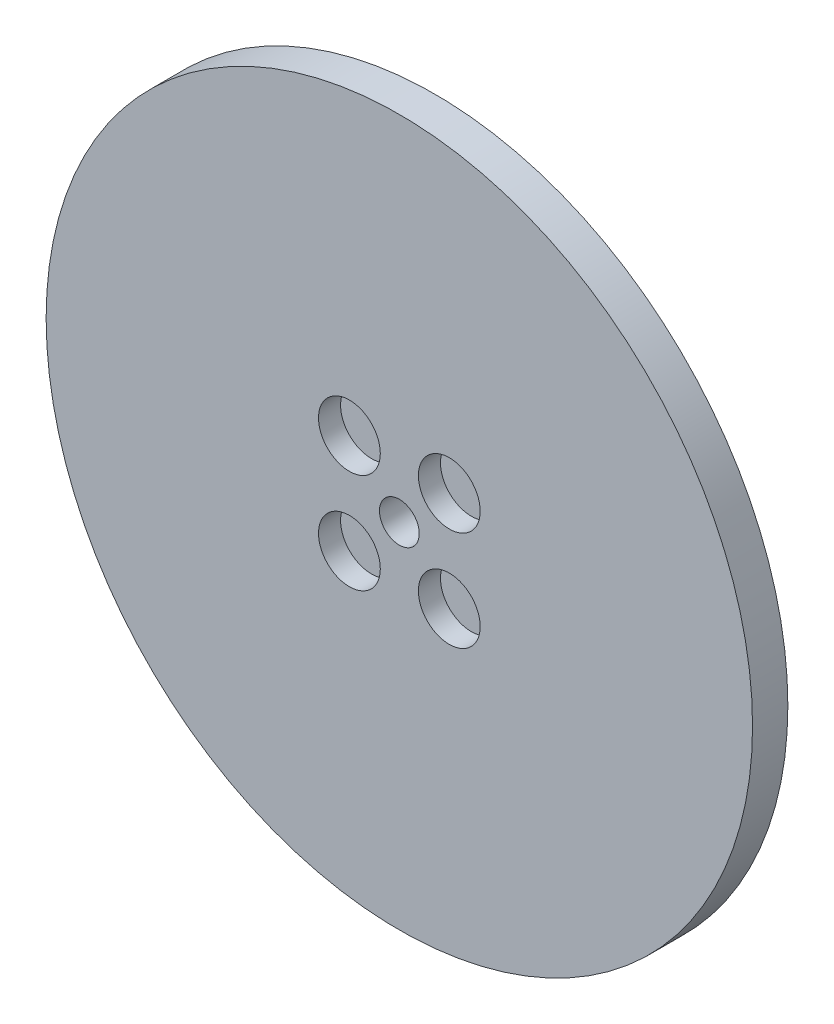
ISO-10303-21;
HEADER;
FILE_DESCRIPTION(('STEP AP214'),'2;1');
FILE_NAME('part.step','',(''),(''),'','','');
FILE_SCHEMA(('AUTOMOTIVE_DESIGN { 1 0 10303 214 1 1 1 1 }'));
ENDSEC;
DATA;
#1=APPLICATION_CONTEXT('core data for automotive mechanical design processes');
#2=APPLICATION_PROTOCOL_DEFINITION('international standard','automotive_design',2000,#1);
#3=PRODUCT_CONTEXT('',#1,'mechanical');
#4=PRODUCT('Part','Part','',(#3));
#5=PRODUCT_RELATED_PRODUCT_CATEGORY('part','',(#4));
#6=PRODUCT_DEFINITION_FORMATION('','',#4);
#7=PRODUCT_DEFINITION_CONTEXT('part definition',#1,'design');
#8=PRODUCT_DEFINITION('design','',#6,#7);
#9=PRODUCT_DEFINITION_SHAPE('','',#8);
#10=(LENGTH_UNIT() NAMED_UNIT(*) SI_UNIT(.MILLI.,.METRE.));
#11=(NAMED_UNIT(*) PLANE_ANGLE_UNIT() SI_UNIT($,.RADIAN.));
#12=(NAMED_UNIT(*) SI_UNIT($,.STERADIAN.) SOLID_ANGLE_UNIT());
#13=UNCERTAINTY_MEASURE_WITH_UNIT(LENGTH_MEASURE(1.E-05),#10,'distance_accuracy_value','');
#14=(GEOMETRIC_REPRESENTATION_CONTEXT(3) GLOBAL_UNCERTAINTY_ASSIGNED_CONTEXT((#13)) GLOBAL_UNIT_ASSIGNED_CONTEXT((#10,
#11,#12)) REPRESENTATION_CONTEXT('',''));
#15=CARTESIAN_POINT('',(0.,0.,0.));
#16=DIRECTION('',(0.,0.,1.));
#17=DIRECTION('',(1.,0.,0.));
#18=AXIS2_PLACEMENT_3D('',#15,#16,#17);
#19=CARTESIAN_POINT('',(5.65599974191923,-5.65770862800566,8.));
#20=DIRECTION('',(0.,0.,-1.));
#21=DIRECTION('',(-1.,0.,0.));
#22=AXIS2_PLACEMENT_3D('',#19,#20,#21);
#23=CYLINDRICAL_SURFACE('',#22,1.5);
#24=CARTESIAN_POINT('',(5.65599974191923,-5.65770862800566,4.));
#25=DIRECTION('',(0.,0.,1.));
#26=DIRECTION('',(1.,0.,0.));
#27=AXIS2_PLACEMENT_3D('',#24,#25,#26);
#28=CIRCLE('',#27,1.5);
#29=CARTESIAN_POINT('',(7.15599974191923,-5.65770862800566,4.));
#30=VERTEX_POINT('',#29);
#31=EDGE_CURVE('E188',#30,#30,#28,.T.);
#32=ORIENTED_EDGE('',*,*,#31,.F.);
#33=EDGE_LOOP('',(#32));
#34=FACE_BOUND('',#33,.T.);
#35=CARTESIAN_POINT('',(5.65599974191923,-5.65770862800566,5.3));
#36=DIRECTION('',(0.,0.,1.));
#37=DIRECTION('',(1.,0.,0.));
#38=AXIS2_PLACEMENT_3D('',#35,#36,#37);
#39=CIRCLE('',#38,1.5);
#40=CARTESIAN_POINT('',(7.15599974191923,-5.65770862800566,5.3));
#41=VERTEX_POINT('',#40);
#42=EDGE_CURVE('E43',#41,#41,#39,.T.);
#43=ORIENTED_EDGE('',*,*,#42,.T.);
#44=EDGE_LOOP('',(#43));
#45=FACE_BOUND('',#44,.T.);
#46=ADVANCED_FACE('F39',(#34,#45),#23,.F.);
#47=CARTESIAN_POINT('',(-5.65599974191923,-5.65770862800566,8.));
#48=DIRECTION('',(0.,0.,-1.));
#49=DIRECTION('',(-1.,0.,0.));
#50=AXIS2_PLACEMENT_3D('',#47,#48,#49);
#51=CYLINDRICAL_SURFACE('',#50,1.5);
#52=CARTESIAN_POINT('',(-5.65599974191923,-5.65770862800566,4.));
#53=DIRECTION('',(0.,0.,1.));
#54=DIRECTION('',(1.,0.,0.));
#55=AXIS2_PLACEMENT_3D('',#52,#53,#54);
#56=CIRCLE('',#55,1.5);
#57=CARTESIAN_POINT('',(-4.15599974191923,-5.65770862800566,4.));
#58=VERTEX_POINT('',#57);
#59=EDGE_CURVE('E185',#58,#58,#56,.T.);
#60=ORIENTED_EDGE('',*,*,#59,.F.);
#61=EDGE_LOOP('',(#60));
#62=FACE_BOUND('',#61,.T.);
#63=CARTESIAN_POINT('',(-5.65599974191923,-5.65770862800566,5.3));
#64=DIRECTION('',(0.,0.,1.));
#65=DIRECTION('',(1.,0.,0.));
#66=AXIS2_PLACEMENT_3D('',#63,#64,#65);
#67=CIRCLE('',#66,1.5);
#68=CARTESIAN_POINT('',(-4.15599974191923,-5.65770862800566,5.3));
#69=VERTEX_POINT('',#68);
#70=EDGE_CURVE('E63',#69,#69,#67,.T.);
#71=ORIENTED_EDGE('',*,*,#70,.T.);
#72=EDGE_LOOP('',(#71));
#73=FACE_BOUND('',#72,.T.);
#74=ADVANCED_FACE('F82',(#62,#73),#51,.F.);
#75=CARTESIAN_POINT('',(5.65599974191923,5.65770862800566,8.));
#76=DIRECTION('',(0.,0.,-1.));
#77=DIRECTION('',(-1.,0.,0.));
#78=AXIS2_PLACEMENT_3D('',#75,#76,#77);
#79=CYLINDRICAL_SURFACE('',#78,1.5);
#80=CARTESIAN_POINT('',(5.65599974191923,5.65770862800566,4.));
#81=DIRECTION('',(0.,0.,1.));
#82=DIRECTION('',(1.,0.,0.));
#83=AXIS2_PLACEMENT_3D('',#80,#81,#82);
#84=CIRCLE('',#83,1.5);
#85=CARTESIAN_POINT('',(7.15599974191923,5.65770862800566,4.));
#86=VERTEX_POINT('',#85);
#87=EDGE_CURVE('E191',#86,#86,#84,.T.);
#88=ORIENTED_EDGE('',*,*,#87,.F.);
#89=EDGE_LOOP('',(#88));
#90=FACE_BOUND('',#89,.T.);
#91=CARTESIAN_POINT('',(5.65599974191923,5.65770862800566,5.3));
#92=DIRECTION('',(0.,0.,1.));
#93=DIRECTION('',(1.,0.,0.));
#94=AXIS2_PLACEMENT_3D('',#91,#92,#93);
#95=CIRCLE('',#94,1.5);
#96=CARTESIAN_POINT('',(7.15599974191923,5.65770862800566,5.3));
#97=VERTEX_POINT('',#96);
#98=EDGE_CURVE('E61',#97,#97,#95,.T.);
#99=ORIENTED_EDGE('',*,*,#98,.T.);
#100=EDGE_LOOP('',(#99));
#101=FACE_BOUND('',#100,.T.);
#102=ADVANCED_FACE('F89',(#90,#101),#79,.F.);
#103=CARTESIAN_POINT('',(-5.65599974191923,5.65770862800566,8.));
#104=DIRECTION('',(0.,0.,-1.));
#105=DIRECTION('',(-1.,0.,0.));
#106=AXIS2_PLACEMENT_3D('',#103,#104,#105);
#107=CYLINDRICAL_SURFACE('',#106,1.5);
#108=CARTESIAN_POINT('',(-5.65599974191923,5.65770862800566,4.));
#109=DIRECTION('',(0.,0.,1.));
#110=DIRECTION('',(1.,0.,0.));
#111=AXIS2_PLACEMENT_3D('',#108,#109,#110);
#112=CIRCLE('',#111,1.5);
#113=CARTESIAN_POINT('',(-4.15599974191923,5.65770862800566,4.));
#114=VERTEX_POINT('',#113);
#115=EDGE_CURVE('E180',#114,#114,#112,.T.);
#116=ORIENTED_EDGE('',*,*,#115,.F.);
#117=EDGE_LOOP('',(#116));
#118=FACE_BOUND('',#117,.T.);
#119=CARTESIAN_POINT('',(-5.65599974191923,5.65770862800566,5.3));
#120=DIRECTION('',(0.,0.,1.));
#121=DIRECTION('',(1.,0.,0.));
#122=AXIS2_PLACEMENT_3D('',#119,#120,#121);
#123=CIRCLE('',#122,1.5);
#124=CARTESIAN_POINT('',(-4.15599974191923,5.65770862800566,5.3));
#125=VERTEX_POINT('',#124);
#126=EDGE_CURVE('E57',#125,#125,#123,.T.);
#127=ORIENTED_EDGE('',*,*,#126,.T.);
#128=EDGE_LOOP('',(#127));
#129=FACE_BOUND('',#128,.T.);
#130=ADVANCED_FACE('F96',(#118,#129),#107,.F.);
#131=CARTESIAN_POINT('',(0.,0.,0.));
#132=DIRECTION('',(0.,0.,1.));
#133=DIRECTION('',(1.,0.,0.));
#134=AXIS2_PLACEMENT_3D('',#131,#132,#133);
#135=PLANE('',#134);
#136=CARTESIAN_POINT('',(0.,-20.,0.));
#137=DIRECTION('',(0.,0.,-1.));
#138=DIRECTION('',(-1.,0.,0.));
#139=AXIS2_PLACEMENT_3D('',#136,#137,#138);
#140=CIRCLE('',#139,5.15);
#141=CARTESIAN_POINT('',(-5.15000000000007,-20.,0.));
#142=VERTEX_POINT('',#141);
#143=EDGE_CURVE('E132',#142,#142,#140,.T.);
#144=ORIENTED_EDGE('',*,*,#143,.F.);
#145=EDGE_LOOP('',(#144));
#146=FACE_BOUND('',#145,.T.);
#147=CARTESIAN_POINT('',(-20.,1.39659253553725E-13,0.));
#148=DIRECTION('',(0.,0.,-1.));
#149=DIRECTION('',(-1.,0.,0.));
#150=AXIS2_PLACEMENT_3D('',#147,#148,#149);
#151=CIRCLE('',#150,5.15);
#152=CARTESIAN_POINT('',(-25.15,1.39659253553725E-13,0.));
#153=VERTEX_POINT('',#152);
#154=EDGE_CURVE('E136',#153,#153,#151,.T.);
#155=ORIENTED_EDGE('',*,*,#154,.F.);
#156=EDGE_LOOP('',(#155));
#157=FACE_BOUND('',#156,.T.);
#158=CARTESIAN_POINT('',(2.09488880330588E-13,20.,0.));
#159=DIRECTION('',(0.,0.,-1.));
#160=DIRECTION('',(-1.,0.,0.));
#161=AXIS2_PLACEMENT_3D('',#158,#159,#160);
#162=CIRCLE('',#161,5.15);
#163=CARTESIAN_POINT('',(-5.14999999999979,20.,0.));
#164=VERTEX_POINT('',#163);
#165=EDGE_CURVE('E140',#164,#164,#162,.T.);
#166=ORIENTED_EDGE('',*,*,#165,.F.);
#167=EDGE_LOOP('',(#166));
#168=FACE_BOUND('',#167,.T.);
#169=CARTESIAN_POINT('',(-14.1421356237308,14.1421356237311,0.));
#170=DIRECTION('',(0.,0.,-1.));
#171=DIRECTION('',(-1.,0.,0.));
#172=AXIS2_PLACEMENT_3D('',#169,#170,#171);
#173=CIRCLE('',#172,2.65);
#174=CARTESIAN_POINT('',(-16.7921356237308,14.1421356237311,0.));
#175=VERTEX_POINT('',#174);
#176=EDGE_CURVE('E144',#175,#175,#173,.T.);
#177=ORIENTED_EDGE('',*,*,#176,.F.);
#178=EDGE_LOOP('',(#177));
#179=FACE_BOUND('',#178,.T.);
#180=CARTESIAN_POINT('',(-14.142135623731,-14.1421356237309,0.));
#181=DIRECTION('',(0.,0.,-1.));
#182=DIRECTION('',(-1.,0.,0.));
#183=AXIS2_PLACEMENT_3D('',#180,#181,#182);
#184=CIRCLE('',#183,2.65);
#185=CARTESIAN_POINT('',(-16.792135623731,-14.1421356237309,0.));
#186=VERTEX_POINT('',#185);
#187=EDGE_CURVE('E148',#186,#186,#184,.T.);
#188=ORIENTED_EDGE('',*,*,#187,.F.);
#189=EDGE_LOOP('',(#188));
#190=FACE_BOUND('',#189,.T.);
#191=CARTESIAN_POINT('',(14.1421356237309,-14.142135623731,0.));
#192=DIRECTION('',(0.,0.,-1.));
#193=DIRECTION('',(-1.,0.,0.));
#194=AXIS2_PLACEMENT_3D('',#191,#192,#193);
#195=CIRCLE('',#194,2.65);
#196=CARTESIAN_POINT('',(11.4921356237309,-14.142135623731,0.));
#197=VERTEX_POINT('',#196);
#198=EDGE_CURVE('E152',#197,#197,#195,.T.);
#199=ORIENTED_EDGE('',*,*,#198,.F.);
#200=EDGE_LOOP('',(#199));
#201=FACE_BOUND('',#200,.T.);
#202=CARTESIAN_POINT('',(14.1421356237309,14.142135623731,0.));
#203=DIRECTION('',(0.,0.,-1.));
#204=DIRECTION('',(-1.,0.,0.));
#205=AXIS2_PLACEMENT_3D('',#202,#203,#204);
#206=CIRCLE('',#205,2.65);
#207=CARTESIAN_POINT('',(11.4921356237309,14.142135623731,0.));
#208=VERTEX_POINT('',#207);
#209=EDGE_CURVE('E156',#208,#208,#206,.T.);
#210=ORIENTED_EDGE('',*,*,#209,.F.);
#211=EDGE_LOOP('',(#210));
#212=FACE_BOUND('',#211,.T.);
#213=CARTESIAN_POINT('',(20.,0.,0.));
#214=DIRECTION('',(0.,0.,-1.));
#215=DIRECTION('',(-1.,0.,0.));
#216=AXIS2_PLACEMENT_3D('',#213,#214,#215);
#217=CIRCLE('',#216,5.15);
#218=CARTESIAN_POINT('',(14.85,0.,0.));
#219=VERTEX_POINT('',#218);
#220=EDGE_CURVE('E160',#219,#219,#217,.T.);
#221=ORIENTED_EDGE('',*,*,#220,.F.);
#222=EDGE_LOOP('',(#221));
#223=FACE_BOUND('',#222,.T.);
#224=CARTESIAN_POINT('',(0.,0.,0.));
#225=DIRECTION('',(0.,0.,1.));
#226=DIRECTION('',(1.,0.,0.));
#227=AXIS2_PLACEMENT_3D('',#224,#225,#226);
#228=CIRCLE('',#227,30.);
#229=CARTESIAN_POINT('',(30.,0.,0.));
#230=VERTEX_POINT('',#229);
#231=EDGE_CURVE('E47',#230,#230,#228,.T.);
#232=ORIENTED_EDGE('',*,*,#231,.F.);
#233=EDGE_LOOP('',(#232));
#234=FACE_BOUND('',#233,.T.);
#235=CARTESIAN_POINT('',(0.,0.,0.));
#236=DIRECTION('',(0.,0.,1.));
#237=DIRECTION('',(1.,0.,0.));
#238=AXIS2_PLACEMENT_3D('',#235,#236,#237);
#239=CIRCLE('',#238,12.5);
#240=CARTESIAN_POINT('',(12.5,0.,0.));
#241=VERTEX_POINT('',#240);
#242=EDGE_CURVE('E52',#241,#241,#239,.T.);
#243=ORIENTED_EDGE('',*,*,#242,.T.);
#244=EDGE_LOOP('',(#243));
#245=FACE_BOUND('',#244,.T.);
#246=ADVANCED_FACE('F99',(#146,#157,#168,#179,#190,#201,#212,#223,#234,#245),#135,.F.);
#247=CARTESIAN_POINT('',(0.,0.,4.));
#248=DIRECTION('',(0.,0.,-1.));
#249=DIRECTION('',(-1.,0.,0.));
#250=AXIS2_PLACEMENT_3D('',#247,#248,#249);
#251=CYLINDRICAL_SURFACE('',#250,30.);
#252=CARTESIAN_POINT('',(0.,0.,4.));
#253=DIRECTION('',(0.,0.,1.));
#254=DIRECTION('',(1.,0.,0.));
#255=AXIS2_PLACEMENT_3D('',#252,#253,#254);
#256=CIRCLE('',#255,30.);
#257=CARTESIAN_POINT('',(30.,0.,4.));
#258=VERTEX_POINT('',#257);
#259=EDGE_CURVE('E10',#258,#258,#256,.T.);
#260=ORIENTED_EDGE('',*,*,#259,.F.);
#261=EDGE_LOOP('',(#260));
#262=FACE_BOUND('',#261,.T.);
#263=ORIENTED_EDGE('',*,*,#231,.T.);
#264=EDGE_LOOP('',(#263));
#265=FACE_BOUND('',#264,.T.);
#266=ADVANCED_FACE('F41',(#262,#265),#251,.T.);
#267=CARTESIAN_POINT('',(0.,0.,4.));
#268=DIRECTION('',(0.,0.,-1.));
#269=DIRECTION('',(-1.,0.,0.));
#270=AXIS2_PLACEMENT_3D('',#267,#268,#269);
#271=CYLINDRICAL_SURFACE('',#270,12.5);
#272=CARTESIAN_POINT('',(0.,0.,4.));
#273=DIRECTION('',(0.,0.,1.));
#274=DIRECTION('',(1.,0.,0.));
#275=AXIS2_PLACEMENT_3D('',#272,#273,#274);
#276=CIRCLE('',#275,12.5);
#277=CARTESIAN_POINT('',(12.5,0.,4.));
#278=VERTEX_POINT('',#277);
#279=EDGE_CURVE('E166',#278,#278,#276,.T.);
#280=ORIENTED_EDGE('',*,*,#279,.T.);
#281=EDGE_LOOP('',(#280));
#282=FACE_BOUND('',#281,.T.);
#283=ORIENTED_EDGE('',*,*,#242,.F.);
#284=EDGE_LOOP('',(#283));
#285=FACE_BOUND('',#284,.T.);
#286=ADVANCED_FACE('F118',(#282,#285),#271,.F.);
#287=CARTESIAN_POINT('',(0.,0.,4.));
#288=DIRECTION('',(0.,0.,1.));
#289=DIRECTION('',(1.,0.,0.));
#290=AXIS2_PLACEMENT_3D('',#287,#288,#289);
#291=PLANE('',#290);
#292=ORIENTED_EDGE('',*,*,#87,.T.);
#293=EDGE_LOOP('',(#292));
#294=FACE_BOUND('',#293,.T.);
#295=ORIENTED_EDGE('',*,*,#31,.T.);
#296=EDGE_LOOP('',(#295));
#297=FACE_BOUND('',#296,.T.);
#298=ORIENTED_EDGE('',*,*,#59,.T.);
#299=EDGE_LOOP('',(#298));
#300=FACE_BOUND('',#299,.T.);
#301=ORIENTED_EDGE('',*,*,#115,.T.);
#302=EDGE_LOOP('',(#301));
#303=FACE_BOUND('',#302,.T.);
#304=CARTESIAN_POINT('',(0.,0.,4.));
#305=DIRECTION('',(0.,0.,1.));
#306=DIRECTION('',(1.,0.,0.));
#307=AXIS2_PLACEMENT_3D('',#304,#305,#306);
#308=CIRCLE('',#307,2.25);
#309=CARTESIAN_POINT('',(2.25,0.,4.));
#310=VERTEX_POINT('',#309);
#311=EDGE_CURVE('E177',#310,#310,#308,.T.);
#312=ORIENTED_EDGE('',*,*,#311,.T.);
#313=EDGE_LOOP('',(#312));
#314=FACE_BOUND('',#313,.T.);
#315=ORIENTED_EDGE('',*,*,#279,.F.);
#316=EDGE_LOOP('',(#315));
#317=FACE_BOUND('',#316,.T.);
#318=ADVANCED_FACE('F111',(#294,#297,#300,#303,#314,#317),#291,.F.);
#319=CARTESIAN_POINT('',(0.,0.,8.));
#320=DIRECTION('',(0.,0.,1.));
#321=DIRECTION('',(1.,0.,0.));
#322=AXIS2_PLACEMENT_3D('',#319,#320,#321);
#323=PLANE('',#322);
#324=CARTESIAN_POINT('',(-5.65599974191923,-5.65770862800566,8.));
#325=DIRECTION('',(0.,0.,1.));
#326=DIRECTION('',(1.,0.,0.));
#327=AXIS2_PLACEMENT_3D('',#324,#325,#326);
#328=CIRCLE('',#327,3.5);
#329=CARTESIAN_POINT('',(-2.15599974191923,-5.65770862800566,8.));
#330=VERTEX_POINT('',#329);
#331=EDGE_CURVE('E204',#330,#330,#328,.T.);
#332=ORIENTED_EDGE('',*,*,#331,.F.);
#333=EDGE_LOOP('',(#332));
#334=FACE_BOUND('',#333,.T.);
#335=CARTESIAN_POINT('',(5.65599974191923,-5.65770862800566,8.));
#336=DIRECTION('',(0.,0.,1.));
#337=DIRECTION('',(1.,0.,0.));
#338=AXIS2_PLACEMENT_3D('',#335,#336,#337);
#339=CIRCLE('',#338,3.5);
#340=CARTESIAN_POINT('',(9.15599974191923,-5.65770862800566,8.));
#341=VERTEX_POINT('',#340);
#342=EDGE_CURVE('E211',#341,#341,#339,.T.);
#343=ORIENTED_EDGE('',*,*,#342,.F.);
#344=EDGE_LOOP('',(#343));
#345=FACE_BOUND('',#344,.T.);
#346=CARTESIAN_POINT('',(5.65599974191923,5.65770862800566,8.));
#347=DIRECTION('',(0.,0.,1.));
#348=DIRECTION('',(1.,0.,0.));
#349=AXIS2_PLACEMENT_3D('',#346,#347,#348);
#350=CIRCLE('',#349,3.5);
#351=CARTESIAN_POINT('',(9.15599974191923,5.65770862800566,8.));
#352=VERTEX_POINT('',#351);
#353=EDGE_CURVE('E198',#352,#352,#350,.T.);
#354=ORIENTED_EDGE('',*,*,#353,.F.);
#355=EDGE_LOOP('',(#354));
#356=FACE_BOUND('',#355,.T.);
#357=CARTESIAN_POINT('',(-5.65599974191923,5.65770862800566,8.));
#358=DIRECTION('',(0.,0.,1.));
#359=DIRECTION('',(1.,0.,0.));
#360=AXIS2_PLACEMENT_3D('',#357,#358,#359);
#361=CIRCLE('',#360,3.5);
#362=CARTESIAN_POINT('',(-2.15599974191923,5.65770862800566,8.));
#363=VERTEX_POINT('',#362);
#364=EDGE_CURVE('E195',#363,#363,#361,.T.);
#365=ORIENTED_EDGE('',*,*,#364,.F.);
#366=EDGE_LOOP('',(#365));
#367=FACE_BOUND('',#366,.T.);
#368=CARTESIAN_POINT('',(0.,0.,8.));
#369=DIRECTION('',(0.,0.,1.));
#370=DIRECTION('',(1.,0.,0.));
#371=AXIS2_PLACEMENT_3D('',#368,#369,#370);
#372=CIRCLE('',#371,40.);
#373=CARTESIAN_POINT('',(40.,0.,8.));
#374=VERTEX_POINT('',#373);
#375=EDGE_CURVE('E168',#374,#374,#372,.T.);
#376=ORIENTED_EDGE('',*,*,#375,.T.);
#377=EDGE_LOOP('',(#376));
#378=FACE_BOUND('',#377,.T.);
#379=CARTESIAN_POINT('',(0.,0.,8.));
#380=DIRECTION('',(0.,0.,1.));
#381=DIRECTION('',(1.,0.,0.));
#382=AXIS2_PLACEMENT_3D('',#379,#380,#381);
#383=CIRCLE('',#382,2.25);
#384=CARTESIAN_POINT('',(2.25,0.,8.));
#385=VERTEX_POINT('',#384);
#386=EDGE_CURVE('E175',#385,#385,#383,.T.);
#387=ORIENTED_EDGE('',*,*,#386,.F.);
#388=EDGE_LOOP('',(#387));
#389=FACE_BOUND('',#388,.T.);
#390=ADVANCED_FACE('F107',(#334,#345,#356,#367,#378,#389),#323,.T.);
#391=ORIENTED_EDGE('',*,*,#259,.T.);
#392=EDGE_LOOP('',(#391));
#393=FACE_BOUND('',#392,.T.);
#394=CARTESIAN_POINT('',(0.,0.,4.));
#395=DIRECTION('',(0.,0.,1.));
#396=DIRECTION('',(1.,0.,0.));
#397=AXIS2_PLACEMENT_3D('',#394,#395,#396);
#398=CIRCLE('',#397,40.);
#399=CARTESIAN_POINT('',(40.,0.,4.));
#400=VERTEX_POINT('',#399);
#401=EDGE_CURVE('E171',#400,#400,#398,.T.);
#402=ORIENTED_EDGE('',*,*,#401,.F.);
#403=EDGE_LOOP('',(#402));
#404=FACE_BOUND('',#403,.T.);
#405=ADVANCED_FACE('F110',(#393,#404),#291,.F.);
#406=CARTESIAN_POINT('',(0.,0.,8.));
#407=DIRECTION('',(0.,0.,-1.));
#408=DIRECTION('',(-1.,0.,0.));
#409=AXIS2_PLACEMENT_3D('',#406,#407,#408);
#410=CYLINDRICAL_SURFACE('',#409,40.);
#411=ORIENTED_EDGE('',*,*,#375,.F.);
#412=EDGE_LOOP('',(#411));
#413=FACE_BOUND('',#412,.T.);
#414=ORIENTED_EDGE('',*,*,#401,.T.);
#415=EDGE_LOOP('',(#414));
#416=FACE_BOUND('',#415,.T.);
#417=ADVANCED_FACE('F105',(#413,#416),#410,.T.);
#418=CARTESIAN_POINT('',(0.,0.,8.));
#419=DIRECTION('',(0.,0.,-1.));
#420=DIRECTION('',(-1.,0.,0.));
#421=AXIS2_PLACEMENT_3D('',#418,#419,#420);
#422=CYLINDRICAL_SURFACE('',#421,2.25);
#423=ORIENTED_EDGE('',*,*,#386,.T.);
#424=EDGE_LOOP('',(#423));
#425=FACE_BOUND('',#424,.T.);
#426=ORIENTED_EDGE('',*,*,#311,.F.);
#427=EDGE_LOOP('',(#426));
#428=FACE_BOUND('',#427,.T.);
#429=ADVANCED_FACE('F101',(#425,#428),#422,.F.);
#430=CARTESIAN_POINT('',(5.65599974191923,5.65770862800566,5.5));
#431=DIRECTION('',(0.,0.,1.));
#432=DIRECTION('',(1.,0.,0.));
#433=AXIS2_PLACEMENT_3D('',#430,#431,#432);
#434=CYLINDRICAL_SURFACE('',#433,3.5);
#435=CARTESIAN_POINT('',(5.65599974191923,5.65770862800566,5.5));
#436=DIRECTION('',(0.,0.,1.));
#437=DIRECTION('',(1.,0.,0.));
#438=AXIS2_PLACEMENT_3D('',#435,#436,#437);
#439=CIRCLE('',#438,3.5);
#440=CARTESIAN_POINT('',(9.15599974191923,5.65770862800566,5.5));
#441=VERTEX_POINT('',#440);
#442=EDGE_CURVE('E214',#441,#441,#439,.T.);
#443=ORIENTED_EDGE('',*,*,#442,.F.);
#444=EDGE_LOOP('',(#443));
#445=FACE_BOUND('',#444,.T.);
#446=ORIENTED_EDGE('',*,*,#353,.T.);
#447=EDGE_LOOP('',(#446));
#448=FACE_BOUND('',#447,.T.);
#449=ADVANCED_FACE('F104',(#445,#448),#434,.F.);
#450=CARTESIAN_POINT('',(5.65599974191923,5.65770862800566,5.5));
#451=DIRECTION('',(0.,0.,1.));
#452=DIRECTION('',(1.,0.,0.));
#453=AXIS2_PLACEMENT_3D('',#450,#451,#452);
#454=PLANE('',#453);
#455=ORIENTED_EDGE('',*,*,#442,.T.);
#456=EDGE_LOOP('',(#455));
#457=FACE_BOUND('',#456,.T.);
#458=ADVANCED_FACE('F321',(#457),#454,.T.);
#459=CARTESIAN_POINT('',(5.65599974191923,-5.65770862800566,5.5));
#460=DIRECTION('',(0.,0.,1.));
#461=DIRECTION('',(1.,0.,0.));
#462=AXIS2_PLACEMENT_3D('',#459,#460,#461);
#463=CYLINDRICAL_SURFACE('',#462,3.5);
#464=CARTESIAN_POINT('',(5.65599974191923,-5.65770862800566,5.5));
#465=DIRECTION('',(0.,0.,1.));
#466=DIRECTION('',(1.,0.,0.));
#467=AXIS2_PLACEMENT_3D('',#464,#465,#466);
#468=CIRCLE('',#467,3.5);
#469=CARTESIAN_POINT('',(9.15599974191923,-5.65770862800566,5.5));
#470=VERTEX_POINT('',#469);
#471=EDGE_CURVE('E208',#470,#470,#468,.T.);
#472=ORIENTED_EDGE('',*,*,#471,.F.);
#473=EDGE_LOOP('',(#472));
#474=FACE_BOUND('',#473,.T.);
#475=ORIENTED_EDGE('',*,*,#342,.T.);
#476=EDGE_LOOP('',(#475));
#477=FACE_BOUND('',#476,.T.);
#478=ADVANCED_FACE('F325',(#474,#477),#463,.F.);
#479=CARTESIAN_POINT('',(5.65599974191923,-5.65770862800566,5.5));
#480=DIRECTION('',(0.,0.,1.));
#481=DIRECTION('',(1.,0.,0.));
#482=AXIS2_PLACEMENT_3D('',#479,#480,#481);
#483=PLANE('',#482);
#484=ORIENTED_EDGE('',*,*,#471,.T.);
#485=EDGE_LOOP('',(#484));
#486=FACE_BOUND('',#485,.T.);
#487=ADVANCED_FACE('F329',(#486),#483,.T.);
#488=CARTESIAN_POINT('',(-5.65599974191923,-5.65770862800566,5.5));
#489=DIRECTION('',(0.,0.,1.));
#490=DIRECTION('',(1.,0.,0.));
#491=AXIS2_PLACEMENT_3D('',#488,#489,#490);
#492=CYLINDRICAL_SURFACE('',#491,3.5);
#493=CARTESIAN_POINT('',(-5.65599974191923,-5.65770862800566,5.5));
#494=DIRECTION('',(0.,0.,1.));
#495=DIRECTION('',(1.,0.,0.));
#496=AXIS2_PLACEMENT_3D('',#493,#494,#495);
#497=CIRCLE('',#496,3.5);
#498=CARTESIAN_POINT('',(-2.15599974191923,-5.65770862800566,5.5));
#499=VERTEX_POINT('',#498);
#500=EDGE_CURVE('E201',#499,#499,#497,.T.);
#501=ORIENTED_EDGE('',*,*,#500,.F.);
#502=EDGE_LOOP('',(#501));
#503=FACE_BOUND('',#502,.T.);
#504=ORIENTED_EDGE('',*,*,#331,.T.);
#505=EDGE_LOOP('',(#504));
#506=FACE_BOUND('',#505,.T.);
#507=ADVANCED_FACE('F333',(#503,#506),#492,.F.);
#508=CARTESIAN_POINT('',(-5.65599974191923,-5.65770862800566,5.5));
#509=DIRECTION('',(0.,0.,1.));
#510=DIRECTION('',(1.,0.,0.));
#511=AXIS2_PLACEMENT_3D('',#508,#509,#510);
#512=PLANE('',#511);
#513=ORIENTED_EDGE('',*,*,#500,.T.);
#514=EDGE_LOOP('',(#513));
#515=FACE_BOUND('',#514,.T.);
#516=ADVANCED_FACE('F337',(#515),#512,.T.);
#517=CARTESIAN_POINT('',(-5.65599974191923,5.65770862800566,5.5));
#518=DIRECTION('',(0.,0.,1.));
#519=DIRECTION('',(1.,0.,0.));
#520=AXIS2_PLACEMENT_3D('',#517,#518,#519);
#521=CYLINDRICAL_SURFACE('',#520,3.5);
#522=CARTESIAN_POINT('',(-5.65599974191923,5.65770862800566,5.5));
#523=DIRECTION('',(0.,0.,1.));
#524=DIRECTION('',(1.,0.,0.));
#525=AXIS2_PLACEMENT_3D('',#522,#523,#524);
#526=CIRCLE('',#525,3.5);
#527=CARTESIAN_POINT('',(-2.15599974191923,5.65770862800566,5.5));
#528=VERTEX_POINT('',#527);
#529=EDGE_CURVE('E194',#528,#528,#526,.T.);
#530=ORIENTED_EDGE('',*,*,#529,.F.);
#531=EDGE_LOOP('',(#530));
#532=FACE_BOUND('',#531,.T.);
#533=ORIENTED_EDGE('',*,*,#364,.T.);
#534=EDGE_LOOP('',(#533));
#535=FACE_BOUND('',#534,.T.);
#536=ADVANCED_FACE('F341',(#532,#535),#521,.F.);
#537=CARTESIAN_POINT('',(-5.65599974191923,5.65770862800566,5.5));
#538=DIRECTION('',(0.,0.,1.));
#539=DIRECTION('',(1.,0.,0.));
#540=AXIS2_PLACEMENT_3D('',#537,#538,#539);
#541=PLANE('',#540);
#542=ORIENTED_EDGE('',*,*,#529,.T.);
#543=EDGE_LOOP('',(#542));
#544=FACE_BOUND('',#543,.T.);
#545=ADVANCED_FACE('F317',(#544),#541,.T.);
#546=CARTESIAN_POINT('',(20.,0.,3.));
#547=DIRECTION('',(0.,0.,-1.));
#548=DIRECTION('',(-1.,0.,0.));
#549=AXIS2_PLACEMENT_3D('',#546,#547,#548);
#550=CYLINDRICAL_SURFACE('',#549,5.15);
#551=CARTESIAN_POINT('',(20.,0.,3.));
#552=DIRECTION('',(0.,0.,-1.));
#553=DIRECTION('',(-1.,0.,0.));
#554=AXIS2_PLACEMENT_3D('',#551,#552,#553);
#555=CIRCLE('',#554,5.15);
#556=CARTESIAN_POINT('',(14.85,0.,3.));
#557=VERTEX_POINT('',#556);
#558=EDGE_CURVE('E205',#557,#557,#555,.T.);
#559=ORIENTED_EDGE('',*,*,#558,.F.);
#560=EDGE_LOOP('',(#559));
#561=FACE_BOUND('',#560,.T.);
#562=ORIENTED_EDGE('',*,*,#220,.T.);
#563=EDGE_LOOP('',(#562));
#564=FACE_BOUND('',#563,.T.);
#565=ADVANCED_FACE('F314',(#561,#564),#550,.F.);
#566=CARTESIAN_POINT('',(20.,0.,3.));
#567=DIRECTION('',(0.,0.,-1.));
#568=DIRECTION('',(-1.,0.,0.));
#569=AXIS2_PLACEMENT_3D('',#566,#567,#568);
#570=PLANE('',#569);
#571=ORIENTED_EDGE('',*,*,#558,.T.);
#572=EDGE_LOOP('',(#571));
#573=FACE_BOUND('',#572,.T.);
#574=ADVANCED_FACE('F277',(#573),#570,.T.);
#575=CARTESIAN_POINT('',(14.1421356237309,14.142135623731,3.));
#576=DIRECTION('',(0.,0.,-1.));
#577=DIRECTION('',(-1.,0.,0.));
#578=AXIS2_PLACEMENT_3D('',#575,#576,#577);
#579=CYLINDRICAL_SURFACE('',#578,2.65);
#580=CARTESIAN_POINT('',(14.1421356237309,14.142135623731,3.));
#581=DIRECTION('',(0.,0.,-1.));
#582=DIRECTION('',(-1.,0.,0.));
#583=AXIS2_PLACEMENT_3D('',#580,#581,#582);
#584=CIRCLE('',#583,2.65);
#585=CARTESIAN_POINT('',(11.4921356237309,14.142135623731,3.));
#586=VERTEX_POINT('',#585);
#587=EDGE_CURVE('E60',#586,#586,#584,.T.);
#588=ORIENTED_EDGE('',*,*,#587,.F.);
#589=EDGE_LOOP('',(#588));
#590=FACE_BOUND('',#589,.T.);
#591=ORIENTED_EDGE('',*,*,#209,.T.);
#592=EDGE_LOOP('',(#591));
#593=FACE_BOUND('',#592,.T.);
#594=ADVANCED_FACE('F274',(#590,#593),#579,.F.);
#595=CARTESIAN_POINT('',(14.1421356237309,14.142135623731,3.));
#596=DIRECTION('',(0.,0.,-1.));
#597=DIRECTION('',(-1.,0.,0.));
#598=AXIS2_PLACEMENT_3D('',#595,#596,#597);
#599=PLANE('',#598);
#600=ORIENTED_EDGE('',*,*,#587,.T.);
#601=EDGE_LOOP('',(#600));
#602=FACE_BOUND('',#601,.T.);
#603=ADVANCED_FACE('F271',(#602),#599,.T.);
#604=CARTESIAN_POINT('',(14.1421356237309,-14.142135623731,3.));
#605=DIRECTION('',(0.,0.,-1.));
#606=DIRECTION('',(-1.,0.,0.));
#607=AXIS2_PLACEMENT_3D('',#604,#605,#606);
#608=CYLINDRICAL_SURFACE('',#607,2.65);
#609=CARTESIAN_POINT('',(14.1421356237309,-14.142135623731,3.));
#610=DIRECTION('',(0.,0.,-1.));
#611=DIRECTION('',(-1.,0.,0.));
#612=AXIS2_PLACEMENT_3D('',#609,#610,#611);
#613=CIRCLE('',#612,2.65);
#614=CARTESIAN_POINT('',(11.4921356237309,-14.142135623731,3.));
#615=VERTEX_POINT('',#614);
#616=EDGE_CURVE('E241',#615,#615,#613,.T.);
#617=ORIENTED_EDGE('',*,*,#616,.F.);
#618=EDGE_LOOP('',(#617));
#619=FACE_BOUND('',#618,.T.);
#620=ORIENTED_EDGE('',*,*,#198,.T.);
#621=EDGE_LOOP('',(#620));
#622=FACE_BOUND('',#621,.T.);
#623=ADVANCED_FACE('F262',(#619,#622),#608,.F.);
#624=CARTESIAN_POINT('',(14.1421356237309,-14.142135623731,3.));
#625=DIRECTION('',(0.,0.,-1.));
#626=DIRECTION('',(-1.,0.,0.));
#627=AXIS2_PLACEMENT_3D('',#624,#625,#626);
#628=PLANE('',#627);
#629=ORIENTED_EDGE('',*,*,#616,.T.);
#630=EDGE_LOOP('',(#629));
#631=FACE_BOUND('',#630,.T.);
#632=ADVANCED_FACE('F252',(#631),#628,.T.);
#633=CARTESIAN_POINT('',(-14.142135623731,-14.1421356237309,3.));
#634=DIRECTION('',(0.,0.,-1.));
#635=DIRECTION('',(-1.,0.,0.));
#636=AXIS2_PLACEMENT_3D('',#633,#634,#635);
#637=CYLINDRICAL_SURFACE('',#636,2.65);
#638=CARTESIAN_POINT('',(-14.142135623731,-14.1421356237309,3.));
#639=DIRECTION('',(0.,0.,-1.));
#640=DIRECTION('',(-1.,0.,0.));
#641=AXIS2_PLACEMENT_3D('',#638,#639,#640);
#642=CIRCLE('',#641,2.65);
#643=CARTESIAN_POINT('',(-16.792135623731,-14.1421356237309,3.));
#644=VERTEX_POINT('',#643);
#645=EDGE_CURVE('E245',#644,#644,#642,.T.);
#646=ORIENTED_EDGE('',*,*,#645,.F.);
#647=EDGE_LOOP('',(#646));
#648=FACE_BOUND('',#647,.T.);
#649=ORIENTED_EDGE('',*,*,#187,.T.);
#650=EDGE_LOOP('',(#649));
#651=FACE_BOUND('',#650,.T.);
#652=ADVANCED_FACE('F249',(#648,#651),#637,.F.);
#653=CARTESIAN_POINT('',(-14.142135623731,-14.1421356237309,3.));
#654=DIRECTION('',(0.,0.,-1.));
#655=DIRECTION('',(-1.,0.,0.));
#656=AXIS2_PLACEMENT_3D('',#653,#654,#655);
#657=PLANE('',#656);
#658=ORIENTED_EDGE('',*,*,#645,.T.);
#659=EDGE_LOOP('',(#658));
#660=FACE_BOUND('',#659,.T.);
#661=ADVANCED_FACE('F251',(#660),#657,.T.);
#662=CARTESIAN_POINT('',(-14.1421356237308,14.1421356237311,3.));
#663=DIRECTION('',(0.,0.,-1.));
#664=DIRECTION('',(-1.,0.,0.));
#665=AXIS2_PLACEMENT_3D('',#662,#663,#664);
#666=CYLINDRICAL_SURFACE('',#665,2.65);
#667=CARTESIAN_POINT('',(-14.1421356237308,14.1421356237311,3.));
#668=DIRECTION('',(0.,0.,-1.));
#669=DIRECTION('',(-1.,0.,0.));
#670=AXIS2_PLACEMENT_3D('',#667,#668,#669);
#671=CIRCLE('',#670,2.65);
#672=CARTESIAN_POINT('',(-16.7921356237308,14.1421356237311,3.));
#673=VERTEX_POINT('',#672);
#674=EDGE_CURVE('E222',#673,#673,#671,.T.);
#675=ORIENTED_EDGE('',*,*,#674,.F.);
#676=EDGE_LOOP('',(#675));
#677=FACE_BOUND('',#676,.T.);
#678=ORIENTED_EDGE('',*,*,#176,.T.);
#679=EDGE_LOOP('',(#678));
#680=FACE_BOUND('',#679,.T.);
#681=ADVANCED_FACE('F259',(#677,#680),#666,.F.);
#682=CARTESIAN_POINT('',(-14.1421356237308,14.1421356237311,3.));
#683=DIRECTION('',(0.,0.,-1.));
#684=DIRECTION('',(-1.,0.,0.));
#685=AXIS2_PLACEMENT_3D('',#682,#683,#684);
#686=PLANE('',#685);
#687=ORIENTED_EDGE('',*,*,#674,.T.);
#688=EDGE_LOOP('',(#687));
#689=FACE_BOUND('',#688,.T.);
#690=ADVANCED_FACE('F301',(#689),#686,.T.);
#691=CARTESIAN_POINT('',(2.09488880330588E-13,20.,3.));
#692=DIRECTION('',(0.,0.,-1.));
#693=DIRECTION('',(-1.,0.,0.));
#694=AXIS2_PLACEMENT_3D('',#691,#692,#693);
#695=CYLINDRICAL_SURFACE('',#694,5.15);
#696=CARTESIAN_POINT('',(2.09488880330588E-13,20.,3.));
#697=DIRECTION('',(0.,0.,-1.));
#698=DIRECTION('',(-1.,0.,0.));
#699=AXIS2_PLACEMENT_3D('',#696,#697,#698);
#700=CIRCLE('',#699,5.15);
#701=CARTESIAN_POINT('',(-5.14999999999979,20.,3.));
#702=VERTEX_POINT('',#701);
#703=EDGE_CURVE('E226',#702,#702,#700,.T.);
#704=ORIENTED_EDGE('',*,*,#703,.F.);
#705=EDGE_LOOP('',(#704));
#706=FACE_BOUND('',#705,.T.);
#707=ORIENTED_EDGE('',*,*,#165,.T.);
#708=EDGE_LOOP('',(#707));
#709=FACE_BOUND('',#708,.T.);
#710=ADVANCED_FACE('F298',(#706,#709),#695,.F.);
#711=CARTESIAN_POINT('',(2.09488880330588E-13,20.,3.));
#712=DIRECTION('',(0.,0.,-1.));
#713=DIRECTION('',(-1.,0.,0.));
#714=AXIS2_PLACEMENT_3D('',#711,#712,#713);
#715=PLANE('',#714);
#716=ORIENTED_EDGE('',*,*,#703,.T.);
#717=EDGE_LOOP('',(#716));
#718=FACE_BOUND('',#717,.T.);
#719=ADVANCED_FACE('F293',(#718),#715,.T.);
#720=CARTESIAN_POINT('',(-20.,1.39659253553725E-13,3.));
#721=DIRECTION('',(0.,0.,-1.));
#722=DIRECTION('',(-1.,0.,0.));
#723=AXIS2_PLACEMENT_3D('',#720,#721,#722);
#724=CYLINDRICAL_SURFACE('',#723,5.15);
#725=CARTESIAN_POINT('',(-20.,1.39659253553725E-13,3.));
#726=DIRECTION('',(0.,0.,-1.));
#727=DIRECTION('',(-1.,0.,0.));
#728=AXIS2_PLACEMENT_3D('',#725,#726,#727);
#729=CIRCLE('',#728,5.15);
#730=CARTESIAN_POINT('',(-25.15,1.39659253553725E-13,3.));
#731=VERTEX_POINT('',#730);
#732=EDGE_CURVE('E230',#731,#731,#729,.T.);
#733=ORIENTED_EDGE('',*,*,#732,.F.);
#734=EDGE_LOOP('',(#733));
#735=FACE_BOUND('',#734,.T.);
#736=ORIENTED_EDGE('',*,*,#154,.T.);
#737=EDGE_LOOP('',(#736));
#738=FACE_BOUND('',#737,.T.);
#739=ADVANCED_FACE('F290',(#735,#738),#724,.F.);
#740=CARTESIAN_POINT('',(-20.,1.39659253553725E-13,3.));
#741=DIRECTION('',(0.,0.,-1.));
#742=DIRECTION('',(-1.,0.,0.));
#743=AXIS2_PLACEMENT_3D('',#740,#741,#742);
#744=PLANE('',#743);
#745=ORIENTED_EDGE('',*,*,#732,.T.);
#746=EDGE_LOOP('',(#745));
#747=FACE_BOUND('',#746,.T.);
#748=ADVANCED_FACE('F286',(#747),#744,.T.);
#749=CARTESIAN_POINT('',(0.,-20.,3.));
#750=DIRECTION('',(0.,0.,-1.));
#751=DIRECTION('',(-1.,0.,0.));
#752=AXIS2_PLACEMENT_3D('',#749,#750,#751);
#753=CYLINDRICAL_SURFACE('',#752,5.15);
#754=CARTESIAN_POINT('',(0.,-20.,3.));
#755=DIRECTION('',(0.,0.,-1.));
#756=DIRECTION('',(-1.,0.,0.));
#757=AXIS2_PLACEMENT_3D('',#754,#755,#756);
#758=CIRCLE('',#757,5.15);
#759=CARTESIAN_POINT('',(-5.15000000000007,-20.,3.));
#760=VERTEX_POINT('',#759);
#761=EDGE_CURVE('E234',#760,#760,#758,.T.);
#762=ORIENTED_EDGE('',*,*,#761,.F.);
#763=EDGE_LOOP('',(#762));
#764=FACE_BOUND('',#763,.T.);
#765=ORIENTED_EDGE('',*,*,#143,.T.);
#766=EDGE_LOOP('',(#765));
#767=FACE_BOUND('',#766,.T.);
#768=ADVANCED_FACE('F282',(#764,#767),#753,.F.);
#769=CARTESIAN_POINT('',(0.,-20.,3.));
#770=DIRECTION('',(0.,0.,-1.));
#771=DIRECTION('',(-1.,0.,0.));
#772=AXIS2_PLACEMENT_3D('',#769,#770,#771);
#773=PLANE('',#772);
#774=ORIENTED_EDGE('',*,*,#761,.T.);
#775=EDGE_LOOP('',(#774));
#776=FACE_BOUND('',#775,.T.);
#777=ADVANCED_FACE('F285',(#776),#773,.T.);
#778=CARTESIAN_POINT('',(-5.65599974191923,5.65770862800566,5.3));
#779=DIRECTION('',(0.,0.,1.));
#780=DIRECTION('',(1.,0.,0.));
#781=AXIS2_PLACEMENT_3D('',#778,#779,#780);
#782=PLANE('',#781);
#783=ORIENTED_EDGE('',*,*,#126,.F.);
#784=EDGE_LOOP('',(#783));
#785=FACE_BOUND('',#784,.T.);
#786=ADVANCED_FACE('F267',(#785),#782,.F.);
#787=CARTESIAN_POINT('',(5.65599974191923,5.65770862800566,5.3));
#788=DIRECTION('',(0.,0.,1.));
#789=DIRECTION('',(1.,0.,0.));
#790=AXIS2_PLACEMENT_3D('',#787,#788,#789);
#791=PLANE('',#790);
#792=ORIENTED_EDGE('',*,*,#98,.F.);
#793=EDGE_LOOP('',(#792));
#794=FACE_BOUND('',#793,.T.);
#795=ADVANCED_FACE('F78',(#794),#791,.F.);
#796=CARTESIAN_POINT('',(-5.65599974191923,-5.65770862800566,5.3));
#797=DIRECTION('',(0.,0.,1.));
#798=DIRECTION('',(1.,0.,0.));
#799=AXIS2_PLACEMENT_3D('',#796,#797,#798);
#800=PLANE('',#799);
#801=ORIENTED_EDGE('',*,*,#70,.F.);
#802=EDGE_LOOP('',(#801));
#803=FACE_BOUND('',#802,.T.);
#804=ADVANCED_FACE('F73',(#803),#800,.F.);
#805=CARTESIAN_POINT('',(5.65599974191923,-5.65770862800566,5.3));
#806=DIRECTION('',(0.,0.,1.));
#807=DIRECTION('',(1.,0.,0.));
#808=AXIS2_PLACEMENT_3D('',#805,#806,#807);
#809=PLANE('',#808);
#810=ORIENTED_EDGE('',*,*,#42,.F.);
#811=EDGE_LOOP('',(#810));
#812=FACE_BOUND('',#811,.T.);
#813=ADVANCED_FACE('F71',(#812),#809,.F.);
#814=CLOSED_SHELL('',(#46,#74,#102,#130,#246,#266,#286,#318,#390,#405,#417,#429,#449,#458,#478,
#487,#507,#516,#536,#545,#565,#574,#594,#603,#623,#632,#652,#661,#681,#690,#710,#719,#739,#748,
#768,#777,#786,#795,#804,#813));
#815=MANIFOLD_SOLID_BREP('B2',#814);
#816=ADVANCED_BREP_SHAPE_REPRESENTATION('',(#18,#815),#14);
#817=SHAPE_DEFINITION_REPRESENTATION(#9,#816);
ENDSEC;
END-ISO-10303-21;
